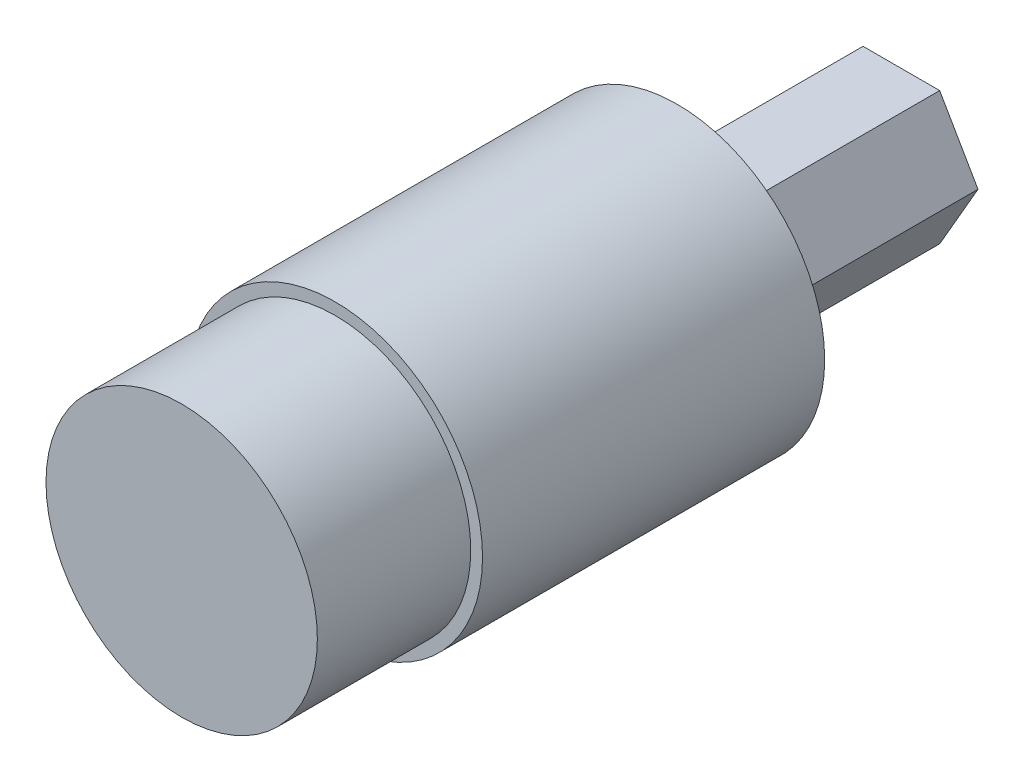
ISO-10303-21;
HEADER;
FILE_DESCRIPTION(('STEP AP214'),'2;1');
FILE_NAME('part.step','',(''),(''),'','','');
FILE_SCHEMA(('AUTOMOTIVE_DESIGN { 1 0 10303 214 1 1 1 1 }'));
ENDSEC;
DATA;
#1=APPLICATION_CONTEXT('core data for automotive mechanical design processes');
#2=APPLICATION_PROTOCOL_DEFINITION('international standard','automotive_design',2000,#1);
#3=PRODUCT_CONTEXT('',#1,'mechanical');
#4=PRODUCT('Part','Part','',(#3));
#5=PRODUCT_RELATED_PRODUCT_CATEGORY('part','',(#4));
#6=PRODUCT_DEFINITION_FORMATION('','',#4);
#7=PRODUCT_DEFINITION_CONTEXT('part definition',#1,'design');
#8=PRODUCT_DEFINITION('design','',#6,#7);
#9=PRODUCT_DEFINITION_SHAPE('','',#8);
#10=(LENGTH_UNIT() NAMED_UNIT(*) SI_UNIT(.MILLI.,.METRE.));
#11=(NAMED_UNIT(*) PLANE_ANGLE_UNIT() SI_UNIT($,.RADIAN.));
#12=(NAMED_UNIT(*) SI_UNIT($,.STERADIAN.) SOLID_ANGLE_UNIT());
#13=UNCERTAINTY_MEASURE_WITH_UNIT(LENGTH_MEASURE(1.E-05),#10,'distance_accuracy_value','');
#14=(GEOMETRIC_REPRESENTATION_CONTEXT(3) GLOBAL_UNCERTAINTY_ASSIGNED_CONTEXT((#13)) GLOBAL_UNIT_ASSIGNED_CONTEXT((#10,
#11,#12)) REPRESENTATION_CONTEXT('',''));
#15=CARTESIAN_POINT('',(0.,0.,0.));
#16=DIRECTION('',(0.,0.,1.));
#17=DIRECTION('',(1.,0.,0.));
#18=AXIS2_PLACEMENT_3D('',#15,#16,#17);
#19=CARTESIAN_POINT('',(0.,0.,53.34));
#20=DIRECTION('',(0.,0.,-1.));
#21=DIRECTION('',(-1.,0.,0.));
#22=AXIS2_PLACEMENT_3D('',#19,#20,#21);
#23=CYLINDRICAL_SURFACE('',#22,15.875);
#24=CARTESIAN_POINT('',(0.,0.,0.));
#25=DIRECTION('',(0.,0.,1.));
#26=DIRECTION('',(1.,0.,0.));
#27=AXIS2_PLACEMENT_3D('',#24,#25,#26);
#28=CIRCLE('',#27,15.875);
#29=CARTESIAN_POINT('',(15.875,0.,0.));
#30=VERTEX_POINT('',#29);
#31=EDGE_CURVE('E12',#30,#30,#28,.T.);
#32=ORIENTED_EDGE('',*,*,#31,.T.);
#33=EDGE_LOOP('',(#32));
#34=FACE_BOUND('',#33,.T.);
#35=CARTESIAN_POINT('',(1.47573332446882,-15.8062593979427,29.6111789912559));
#36=CARTESIAN_POINT('',(1.65475016865893,-15.7895418809201,29.6111718038457));
#37=CARTESIAN_POINT('',(1.83357595181604,-15.7697497542096,29.5959866783168));
#38=CARTESIAN_POINT('',(2.1855963327518,-15.7248331820091,29.5359643248302));
#39=CARTESIAN_POINT('',(2.35878508824279,-15.6997033954727,29.4910973003365));
#40=CARTESIAN_POINT('',(2.69443102462366,-15.6455914181036,29.3733512414853));
#41=CARTESIAN_POINT('',(2.85690301128605,-15.616614716234,29.3005118442731));
#42=CARTESIAN_POINT('',(3.16713215063405,-15.556667118741,29.1289877354717));
#43=CARTESIAN_POINT('',(3.31489040462805,-15.5256963726561,29.0303049602439));
#44=CARTESIAN_POINT('',(3.594451244585,-15.4633905024007,28.8077086166512));
#45=CARTESIAN_POINT('',(3.72591897938713,-15.4320588460277,28.6833730960508));
#46=CARTESIAN_POINT('',(3.96614112887061,-15.3720758002535,28.4138249607425));
#47=CARTESIAN_POINT('',(4.07489435082612,-15.3434245516427,28.2686112504087));
#48=CARTESIAN_POINT('',(4.2663065610253,-15.2913084693007,27.9613149981526));
#49=CARTESIAN_POINT('',(4.34900210998827,-15.2678363828417,27.7992565193034));
#50=CARTESIAN_POINT('',(4.48571690881626,-15.2282328705994,27.462628940546));
#51=CARTESIAN_POINT('',(4.53974404808165,-15.212099425434,27.2880632975707));
#52=CARTESIAN_POINT('',(4.6157447869748,-15.1892085292378,26.9380490132076));
#53=CARTESIAN_POINT('',(4.6387940300353,-15.1821368619704,26.7628544665595));
#54=CARTESIAN_POINT('',(4.65551331163094,-15.1770191051206,26.410953266033));
#55=CARTESIAN_POINT('',(4.64918899765341,-15.1789712805747,26.2342469093424));
#56=CARTESIAN_POINT('',(4.60802156074972,-15.1915169367208,25.88970037717));
#57=CARTESIAN_POINT('',(4.57400376056022,-15.2018603118785,25.7217513658796));
#58=CARTESIAN_POINT('',(4.47968073089897,-15.2299207267939,25.3940652981595));
#59=CARTESIAN_POINT('',(4.41937352633899,-15.2476383205625,25.2343288597378));
#60=CARTESIAN_POINT('',(4.27332938609346,-15.289215093064,24.924965853531));
#61=CARTESIAN_POINT('',(4.18723847795556,-15.3131591055378,24.7755181706815));
#62=CARTESIAN_POINT('',(3.99246080202612,-15.3650908394775,24.4929414278998));
#63=CARTESIAN_POINT('',(3.88376933976613,-15.3930794006867,24.3598157674394));
#64=CARTESIAN_POINT('',(3.64198057650366,-15.4521083647813,24.1081720150649));
#65=CARTESIAN_POINT('',(3.50809546844578,-15.4832252895963,23.9904281427386));
#66=CARTESIAN_POINT('',(3.22248961438754,-15.5451766099479,23.7789146659268));
#67=CARTESIAN_POINT('',(3.07076650801275,-15.5760109675112,23.6851482394284));
#68=CARTESIAN_POINT('',(2.75038951660609,-15.6357920934915,23.5226361796002));
#69=CARTESIAN_POINT('',(2.58147123856515,-15.664692553257,23.4543933647152));
#70=CARTESIAN_POINT('',(2.23381124161288,-15.718034457741,23.347652389426));
#71=CARTESIAN_POINT('',(2.05507060988741,-15.7424763946622,23.3091509441768));
#72=CARTESIAN_POINT('',(1.69596687531345,-15.785165877686,23.2637470722057));
#73=CARTESIAN_POINT('',(1.51568094673126,-15.8035102163008,23.2563267618504));
#74=CARTESIAN_POINT('',(1.15593642833655,-15.8338879163662,23.2722008014547));
#75=CARTESIAN_POINT('',(0.976477720403394,-15.8459222083724,23.2954906207464));
#76=CARTESIAN_POINT('',(0.628035379462351,-15.8635094134711,23.3713670438391));
#77=CARTESIAN_POINT('',(0.458904115662563,-15.8692096952214,23.4232435595835));
#78=CARTESIAN_POINT('',(0.131514431589141,-15.8753001599826,23.5543750850468));
#79=CARTESIAN_POINT('',(-0.0267441266246493,-15.8756904103734,23.6336297473468));
#80=CARTESIAN_POINT('',(-0.327421590863878,-15.8723341995013,23.8169854421605));
#81=CARTESIAN_POINT('',(-0.469886963327943,-15.8686002481245,23.9210105897608));
#82=CARTESIAN_POINT('',(-0.735612225693869,-15.8585060133157,24.1511249997145));
#83=CARTESIAN_POINT('',(-0.858870808693706,-15.8521455512735,24.2772157622568));
#84=CARTESIAN_POINT('',(-1.08414215080199,-15.8383451857864,24.549580021302));
#85=CARTESIAN_POINT('',(-1.18589076089499,-15.8308935737289,24.6960714662323));
#86=CARTESIAN_POINT('',(-1.36348367250784,-15.8165895809933,25.0040243286768));
#87=CARTESIAN_POINT('',(-1.43932744012994,-15.8097372126678,25.1654860546408));
#88=CARTESIAN_POINT('',(-1.56327281526235,-15.7979658368137,25.4997045076692));
#89=CARTESIAN_POINT('',(-1.61123693231466,-15.7930564485178,25.6725126124412));
#90=CARTESIAN_POINT('',(-1.67743949645949,-15.786163101869,26.0237865408233));
#91=CARTESIAN_POINT('',(-1.69567905662325,-15.7841790339741,26.2022521523262));
#92=CARTESIAN_POINT('',(-1.7018788838092,-15.7835117280442,26.5588063420732));
#93=CARTESIAN_POINT('',(-1.68999224227089,-15.784811800976,26.7368922423276));
#94=CARTESIAN_POINT('',(-1.63661314863291,-15.7904347796916,27.0885194965798));
#95=CARTESIAN_POINT('',(-1.59512048609089,-15.7947577069622,27.2620608182653));
#96=CARTESIAN_POINT('',(-1.4837778299595,-15.8056043985312,27.5995679864318));
#97=CARTESIAN_POINT('',(-1.41394949091216,-15.8121264815603,27.7635410359203));
#98=CARTESIAN_POINT('',(-1.24791192775978,-15.8260939776786,28.0774947676895));
#99=CARTESIAN_POINT('',(-1.15170205126861,-15.8335394135988,28.227475103823));
#100=CARTESIAN_POINT('',(-0.934988713488278,-15.847815065442,28.5100440368687));
#101=CARTESIAN_POINT('',(-0.814357756042988,-15.8546417684888,28.6425350671114));
#102=CARTESIAN_POINT('',(-0.552470645322964,-15.8659238020154,28.8854461666304));
#103=CARTESIAN_POINT('',(-0.411211521243918,-15.8703787904982,28.9958630514217));
#104=CARTESIAN_POINT('',(-0.112453032690774,-15.8753024221133,29.1911880791487));
#105=CARTESIAN_POINT('',(0.0450074883273529,-15.8757803848105,29.2761554082144));
#106=CARTESIAN_POINT('',(0.371794568793654,-15.871483690414,29.4183993672056));
#107=CARTESIAN_POINT('',(0.54110974696482,-15.8667140083862,29.4757021506471));
#108=CARTESIAN_POINT('',(0.83851009822069,-15.8533333362174,29.5492336606944));
#109=CARTESIAN_POINT('',(0.964980476238011,-15.8461577918051,29.57245088377));
#110=CARTESIAN_POINT('',(1.21957759480811,-15.8285988139637,29.6034260551002));
#111=CARTESIAN_POINT('',(1.34770432161807,-15.8182154071341,29.6111841315374));
#112=CARTESIAN_POINT('',(1.47573332446882,-15.8062593979427,29.6111789912559));
#113=B_SPLINE_CURVE_WITH_KNOTS('',3,(#35,#36,#37,#38,#39,#40,#41,#42,#43,#44,#45,#46,#47,#48,
#49,#50,#51,#52,#53,#54,#55,#56,#57,#58,#59,#60,#61,#62,#63,#64,#65,#66,#67,#68,#69,#70,#71,#72,
#73,#74,#75,#76,#77,#78,#79,#80,#81,#82,#83,#84,#85,#86,#87,#88,#89,#90,#91,#92,#93,#94,#95,#96,
#97,#98,#99,#100,#101,#102,#103,#104,#105,#106,#107,#108,#109,#110,#111,#112),.UNSPECIFIED.,.T.,
.F.,(4,2,2,2,2,2,2,2,2,2,2,2,2,2,2,2,2,2,2,2,2,2,2,2,2,2,2,2,2,2,2,2,2,2,2,2,2,2,4),(0.,
0.538908429208579,1.07835867079495,1.61704730959281,2.15569559772248,2.70403386967561,
3.25240092731696,3.79999512632357,4.34743855193872,4.87533457539628,5.40312910747947,
5.91574626590288,6.42840194321569,6.94844612927217,7.46859844427776,8.00907914613055,
8.54963144658328,9.10033262271266,9.65097296685112,10.1924009466221,10.7337490584176,
11.2622196318758,11.7906834994797,12.317548776118,12.844449887007,13.3774873466349,
13.9105357914802,14.4461911746698,14.9818264991479,15.5147453646002,16.047668018127,
16.5801841690014,17.1127134895967,17.6480982344426,18.1835601599125,18.717766956059,
19.2514677298451,19.6368866619712,20.0223023983036),.UNSPECIFIED.);
#114=CARTESIAN_POINT('',(1.47573332446882,-15.8062593979427,29.6111789912559));
#115=VERTEX_POINT('',#114);
#116=EDGE_CURVE('E112',#115,#115,#113,.T.);
#117=ORIENTED_EDGE('',*,*,#116,.T.);
#118=EDGE_LOOP('',(#117));
#119=FACE_BOUND('',#118,.T.);
#120=CARTESIAN_POINT('',(0.,0.,36.83));
#121=DIRECTION('',(0.,0.,1.));
#122=DIRECTION('',(1.,0.,0.));
#123=AXIS2_PLACEMENT_3D('',#120,#121,#122);
#124=CIRCLE('',#123,15.875);
#125=CARTESIAN_POINT('',(15.875,0.,36.83));
#126=VERTEX_POINT('',#125);
#127=EDGE_CURVE('E36',#126,#126,#124,.T.);
#128=ORIENTED_EDGE('',*,*,#127,.F.);
#129=EDGE_LOOP('',(#128));
#130=FACE_BOUND('',#129,.T.);
#131=ADVANCED_FACE('F32',(#34,#119,#130),#23,.T.);
#132=CARTESIAN_POINT('',(0.,0.,0.));
#133=DIRECTION('',(0.,0.,1.));
#134=DIRECTION('',(1.,0.,0.));
#135=AXIS2_PLACEMENT_3D('',#132,#133,#134);
#136=PLANE('',#135);
#137=ORIENTED_EDGE('',*,*,#31,.F.);
#138=EDGE_LOOP('',(#137));
#139=FACE_BOUND('',#138,.T.);
#140=DIRECTION('',(-0.5,0.866025403784439,0.));
#141=VECTOR('',#140,1.);
#142=CARTESIAN_POINT('',(-4.12444598552339,-7.14375,0.));
#143=LINE('',#142,#141);
#144=CARTESIAN_POINT('',(-4.12444598552339,-7.14375,0.));
#145=VERTEX_POINT('',#144);
#146=CARTESIAN_POINT('',(-8.24889197104678,0.,0.));
#147=VERTEX_POINT('',#146);
#148=EDGE_CURVE('E107',#145,#147,#143,.T.);
#149=ORIENTED_EDGE('',*,*,#148,.F.);
#150=DIRECTION('',(-1.,0.,0.));
#151=VECTOR('',#150,1.);
#152=CARTESIAN_POINT('',(4.12444598552339,-7.14375,0.));
#153=LINE('',#152,#151);
#154=CARTESIAN_POINT('',(4.12444598552339,-7.14375,0.));
#155=VERTEX_POINT('',#154);
#156=EDGE_CURVE('E104',#155,#145,#153,.T.);
#157=ORIENTED_EDGE('',*,*,#156,.F.);
#158=DIRECTION('',(-0.5,-0.866025403784439,0.));
#159=VECTOR('',#158,1.);
#160=CARTESIAN_POINT('',(8.24889197104678,0.,0.));
#161=LINE('',#160,#159);
#162=CARTESIAN_POINT('',(8.24889197104678,0.,0.));
#163=VERTEX_POINT('',#162);
#164=EDGE_CURVE('E205',#163,#155,#161,.T.);
#165=ORIENTED_EDGE('',*,*,#164,.F.);
#166=DIRECTION('',(0.5,-0.866025403784439,0.));
#167=VECTOR('',#166,1.);
#168=CARTESIAN_POINT('',(4.12444598552339,7.14375,0.));
#169=LINE('',#168,#167);
#170=CARTESIAN_POINT('',(4.12444598552339,7.14375,0.));
#171=VERTEX_POINT('',#170);
#172=EDGE_CURVE('E202',#171,#163,#169,.T.);
#173=ORIENTED_EDGE('',*,*,#172,.F.);
#174=DIRECTION('',(1.,0.,0.));
#175=VECTOR('',#174,1.);
#176=CARTESIAN_POINT('',(-4.12444598552338,7.14375,0.));
#177=LINE('',#176,#175);
#178=CARTESIAN_POINT('',(-4.12444598552338,7.14375,0.));
#179=VERTEX_POINT('',#178);
#180=EDGE_CURVE('E54',#179,#171,#177,.T.);
#181=ORIENTED_EDGE('',*,*,#180,.F.);
#182=DIRECTION('',(0.5,0.866025403784438,0.));
#183=VECTOR('',#182,1.);
#184=CARTESIAN_POINT('',(-8.24889197104678,0.,0.));
#185=LINE('',#184,#183);
#186=EDGE_CURVE('E49',#147,#179,#185,.T.);
#187=ORIENTED_EDGE('',*,*,#186,.F.);
#188=EDGE_LOOP('',(#149,#157,#165,#173,#181,#187));
#189=FACE_BOUND('',#188,.T.);
#190=ADVANCED_FACE('F135',(#139,#189),#136,.F.);
#191=CARTESIAN_POINT('',(-8.24889197104678,0.,-24.13));
#192=DIRECTION('',(0.,0.,-1.));
#193=DIRECTION('',(-1.,0.,0.));
#194=AXIS2_PLACEMENT_3D('',#191,#192,#193);
#195=PLANE('',#194);
#196=DIRECTION('',(-0.5,0.866025403784439,0.));
#197=VECTOR('',#196,1.);
#198=CARTESIAN_POINT('',(-4.12444598552339,-7.14375,-24.13));
#199=LINE('',#198,#197);
#200=CARTESIAN_POINT('',(-4.12444598552339,-7.14375,-24.13));
#201=VERTEX_POINT('',#200);
#202=CARTESIAN_POINT('',(-8.24889197104678,0.,-24.13));
#203=VERTEX_POINT('',#202);
#204=EDGE_CURVE('E94',#201,#203,#199,.T.);
#205=ORIENTED_EDGE('',*,*,#204,.T.);
#206=DIRECTION('',(0.5,0.866025403784438,0.));
#207=VECTOR('',#206,1.);
#208=CARTESIAN_POINT('',(-8.24889197104678,0.,-24.13));
#209=LINE('',#208,#207);
#210=CARTESIAN_POINT('',(-4.12444598552338,7.14375,-24.13));
#211=VERTEX_POINT('',#210);
#212=EDGE_CURVE('E84',#203,#211,#209,.T.);
#213=ORIENTED_EDGE('',*,*,#212,.T.);
#214=DIRECTION('',(1.,0.,0.));
#215=VECTOR('',#214,1.);
#216=CARTESIAN_POINT('',(-4.12444598552338,7.14375,-24.13));
#217=LINE('',#216,#215);
#218=CARTESIAN_POINT('',(4.12444598552339,7.14375,-24.13));
#219=VERTEX_POINT('',#218);
#220=EDGE_CURVE('E93',#211,#219,#217,.T.);
#221=ORIENTED_EDGE('',*,*,#220,.T.);
#222=DIRECTION('',(0.5,-0.866025403784439,0.));
#223=VECTOR('',#222,1.);
#224=CARTESIAN_POINT('',(4.12444598552339,7.14375,-24.13));
#225=LINE('',#224,#223);
#226=CARTESIAN_POINT('',(8.24889197104678,0.,-24.13));
#227=VERTEX_POINT('',#226);
#228=EDGE_CURVE('E193',#219,#227,#225,.T.);
#229=ORIENTED_EDGE('',*,*,#228,.T.);
#230=DIRECTION('',(-0.5,-0.866025403784439,0.));
#231=VECTOR('',#230,1.);
#232=CARTESIAN_POINT('',(8.24889197104678,0.,-24.13));
#233=LINE('',#232,#231);
#234=CARTESIAN_POINT('',(4.12444598552339,-7.14375,-24.13));
#235=VERTEX_POINT('',#234);
#236=EDGE_CURVE('E195',#227,#235,#233,.T.);
#237=ORIENTED_EDGE('',*,*,#236,.T.);
#238=DIRECTION('',(-1.,0.,0.));
#239=VECTOR('',#238,1.);
#240=CARTESIAN_POINT('',(4.12444598552339,-7.14375,-24.13));
#241=LINE('',#240,#239);
#242=EDGE_CURVE('E100',#235,#201,#241,.T.);
#243=ORIENTED_EDGE('',*,*,#242,.T.);
#244=EDGE_LOOP('',(#205,#213,#221,#229,#237,#243));
#245=FACE_BOUND('',#244,.T.);
#246=CARTESIAN_POINT('',(0.,0.,-24.13));
#247=DIRECTION('',(0.,0.,-1.));
#248=DIRECTION('',(-1.,0.,0.));
#249=AXIS2_PLACEMENT_3D('',#246,#247,#248);
#250=CIRCLE('',#249,4.3053);
#251=CARTESIAN_POINT('',(-4.3053,0.,-24.13));
#252=VERTEX_POINT('',#251);
#253=EDGE_CURVE('E188',#252,#252,#250,.T.);
#254=ORIENTED_EDGE('',*,*,#253,.F.);
#255=EDGE_LOOP('',(#254));
#256=FACE_BOUND('',#255,.T.);
#257=ADVANCED_FACE('F97',(#245,#256),#195,.T.);
#258=CARTESIAN_POINT('',(-4.12444598552339,-7.14375,-24.13));
#259=DIRECTION('',(0.866025403784439,0.5,0.));
#260=DIRECTION('',(-0.5,0.866025403784439,0.));
#261=AXIS2_PLACEMENT_3D('',#258,#259,#260);
#262=PLANE('',#261);
#263=ORIENTED_EDGE('',*,*,#148,.T.);
#264=DIRECTION('',(0.,0.,1.));
#265=VECTOR('',#264,1.);
#266=CARTESIAN_POINT('',(-8.24889197104678,0.,-24.13));
#267=LINE('',#266,#265);
#268=EDGE_CURVE('E41',#203,#147,#267,.T.);
#269=ORIENTED_EDGE('',*,*,#268,.F.);
#270=ORIENTED_EDGE('',*,*,#204,.F.);
#271=DIRECTION('',(0.,0.,1.));
#272=VECTOR('',#271,1.);
#273=CARTESIAN_POINT('',(-4.12444598552339,-7.14375,-24.13));
#274=LINE('',#273,#272);
#275=EDGE_CURVE('E198',#201,#145,#274,.T.);
#276=ORIENTED_EDGE('',*,*,#275,.T.);
#277=EDGE_LOOP('',(#263,#269,#270,#276));
#278=FACE_BOUND('',#277,.T.);
#279=ADVANCED_FACE('F106',(#278),#262,.F.);
#280=CARTESIAN_POINT('',(-8.24889197104678,0.,-24.13));
#281=DIRECTION('',(0.866025403784438,-0.5,0.));
#282=DIRECTION('',(0.5,0.866025403784439,0.));
#283=AXIS2_PLACEMENT_3D('',#280,#281,#282);
#284=PLANE('',#283);
#285=ORIENTED_EDGE('',*,*,#186,.T.);
#286=DIRECTION('',(0.,0.,1.));
#287=VECTOR('',#286,1.);
#288=CARTESIAN_POINT('',(-4.12444598552338,7.14375,-24.13));
#289=LINE('',#288,#287);
#290=EDGE_CURVE('E90',#211,#179,#289,.T.);
#291=ORIENTED_EDGE('',*,*,#290,.F.);
#292=ORIENTED_EDGE('',*,*,#212,.F.);
#293=ORIENTED_EDGE('',*,*,#268,.T.);
#294=EDGE_LOOP('',(#285,#291,#292,#293));
#295=FACE_BOUND('',#294,.T.);
#296=ADVANCED_FACE('F86',(#295),#284,.F.);
#297=CARTESIAN_POINT('',(-4.12444598552338,7.14375,-24.13));
#298=DIRECTION('',(0.,-1.,0.));
#299=DIRECTION('',(0.,0.,-1.));
#300=AXIS2_PLACEMENT_3D('',#297,#298,#299);
#301=PLANE('',#300);
#302=ORIENTED_EDGE('',*,*,#180,.T.);
#303=DIRECTION('',(0.,0.,1.));
#304=VECTOR('',#303,1.);
#305=CARTESIAN_POINT('',(4.12444598552339,7.14375,-24.13));
#306=LINE('',#305,#304);
#307=EDGE_CURVE('E109',#219,#171,#306,.T.);
#308=ORIENTED_EDGE('',*,*,#307,.F.);
#309=ORIENTED_EDGE('',*,*,#220,.F.);
#310=ORIENTED_EDGE('',*,*,#290,.T.);
#311=EDGE_LOOP('',(#302,#308,#309,#310));
#312=FACE_BOUND('',#311,.T.);
#313=ADVANCED_FACE('F146',(#312),#301,.F.);
#314=CARTESIAN_POINT('',(4.12444598552339,7.14375,-24.13));
#315=DIRECTION('',(-0.866025403784439,-0.5,0.));
#316=DIRECTION('',(0.5,-0.866025403784439,0.));
#317=AXIS2_PLACEMENT_3D('',#314,#315,#316);
#318=PLANE('',#317);
#319=ORIENTED_EDGE('',*,*,#172,.T.);
#320=DIRECTION('',(0.,0.,1.));
#321=VECTOR('',#320,1.);
#322=CARTESIAN_POINT('',(8.24889197104678,0.,-24.13));
#323=LINE('',#322,#321);
#324=EDGE_CURVE('E214',#227,#163,#323,.T.);
#325=ORIENTED_EDGE('',*,*,#324,.F.);
#326=ORIENTED_EDGE('',*,*,#228,.F.);
#327=ORIENTED_EDGE('',*,*,#307,.T.);
#328=EDGE_LOOP('',(#319,#325,#326,#327));
#329=FACE_BOUND('',#328,.T.);
#330=ADVANCED_FACE('F142',(#329),#318,.F.);
#331=CARTESIAN_POINT('',(8.24889197104678,0.,-24.13));
#332=DIRECTION('',(-0.866025403784439,0.5,0.));
#333=DIRECTION('',(-0.5,-0.866025403784439,0.));
#334=AXIS2_PLACEMENT_3D('',#331,#332,#333);
#335=PLANE('',#334);
#336=ORIENTED_EDGE('',*,*,#164,.T.);
#337=DIRECTION('',(0.,0.,1.));
#338=VECTOR('',#337,1.);
#339=CARTESIAN_POINT('',(4.12444598552339,-7.14375,-24.13));
#340=LINE('',#339,#338);
#341=EDGE_CURVE('E211',#235,#155,#340,.T.);
#342=ORIENTED_EDGE('',*,*,#341,.F.);
#343=ORIENTED_EDGE('',*,*,#236,.F.);
#344=ORIENTED_EDGE('',*,*,#324,.T.);
#345=EDGE_LOOP('',(#336,#342,#343,#344));
#346=FACE_BOUND('',#345,.T.);
#347=ADVANCED_FACE('F138',(#346),#335,.F.);
#348=CARTESIAN_POINT('',(4.12444598552339,-7.14375,-24.13));
#349=DIRECTION('',(0.,1.,0.));
#350=DIRECTION('',(-1.,0.,0.));
#351=AXIS2_PLACEMENT_3D('',#348,#349,#350);
#352=PLANE('',#351);
#353=ORIENTED_EDGE('',*,*,#156,.T.);
#354=ORIENTED_EDGE('',*,*,#275,.F.);
#355=ORIENTED_EDGE('',*,*,#242,.F.);
#356=ORIENTED_EDGE('',*,*,#341,.T.);
#357=EDGE_LOOP('',(#353,#354,#355,#356));
#358=FACE_BOUND('',#357,.T.);
#359=ADVANCED_FACE('F131',(#358),#352,.F.);
#360=CARTESIAN_POINT('',(0.,0.,-24.13));
#361=DIRECTION('',(0.,0.,1.));
#362=DIRECTION('',(1.,0.,0.));
#363=AXIS2_PLACEMENT_3D('',#360,#361,#362);
#364=CYLINDRICAL_SURFACE('',#363,4.3053);
#365=ORIENTED_EDGE('',*,*,#253,.T.);
#366=EDGE_LOOP('',(#365));
#367=FACE_BOUND('',#366,.T.);
#368=CARTESIAN_POINT('',(0.,0.,0.));
#369=DIRECTION('',(0.,0.,-1.));
#370=DIRECTION('',(-1.,0.,0.));
#371=AXIS2_PLACEMENT_3D('',#368,#369,#370);
#372=CIRCLE('',#371,4.3053);
#373=CARTESIAN_POINT('',(-4.3053,0.,0.));
#374=VERTEX_POINT('',#373);
#375=EDGE_CURVE('E117',#374,#374,#372,.T.);
#376=ORIENTED_EDGE('',*,*,#375,.F.);
#377=EDGE_LOOP('',(#376));
#378=FACE_BOUND('',#377,.T.);
#379=ADVANCED_FACE('F128',(#367,#378),#364,.F.);
#380=ORIENTED_EDGE('',*,*,#375,.T.);
#381=EDGE_LOOP('',(#380));
#382=FACE_BOUND('',#381,.T.);
#383=ADVANCED_FACE('F125',(#382),#136,.F.);
#384=CARTESIAN_POINT('',(1.47573332446882,-16.51,26.4361789912559));
#385=DIRECTION('',(0.,1.,0.));
#386=DIRECTION('',(0.,0.,1.));
#387=AXIS2_PLACEMENT_3D('',#384,#385,#386);
#388=CYLINDRICAL_SURFACE('',#387,3.175);
#389=CARTESIAN_POINT('',(1.47573332446882,-16.51,26.4361789912559));
#390=DIRECTION('',(0.,1.,0.));
#391=DIRECTION('',(0.,0.,1.));
#392=AXIS2_PLACEMENT_3D('',#389,#390,#391);
#393=CIRCLE('',#392,3.175);
#394=CARTESIAN_POINT('',(1.47573332446882,-16.51,29.6111789912559));
#395=VERTEX_POINT('',#394);
#396=EDGE_CURVE('E118',#395,#395,#393,.T.);
#397=ORIENTED_EDGE('',*,*,#396,.T.);
#398=EDGE_LOOP('',(#397));
#399=FACE_BOUND('',#398,.T.);
#400=ORIENTED_EDGE('',*,*,#116,.F.);
#401=EDGE_LOOP('',(#400));
#402=FACE_BOUND('',#401,.T.);
#403=ADVANCED_FACE('F119',(#399,#402),#388,.T.);
#404=CARTESIAN_POINT('',(1.47573332446882,-16.51,26.4361789912559));
#405=DIRECTION('',(0.,1.,0.));
#406=DIRECTION('',(0.,0.,1.));
#407=AXIS2_PLACEMENT_3D('',#404,#405,#406);
#408=PLANE('',#407);
#409=ORIENTED_EDGE('',*,*,#396,.F.);
#410=EDGE_LOOP('',(#409));
#411=FACE_BOUND('',#410,.T.);
#412=ADVANCED_FACE('F124',(#411),#408,.F.);
#413=CARTESIAN_POINT('',(0.,-0.317499999999995,36.83));
#414=DIRECTION('',(0.,0.,1.));
#415=DIRECTION('',(1.,0.,0.));
#416=AXIS2_PLACEMENT_3D('',#413,#414,#415);
#417=PLANE('',#416);
#418=CARTESIAN_POINT('',(0.,0.,36.83));
#419=DIRECTION('',(0.,0.,1.));
#420=DIRECTION('',(1.,0.,0.));
#421=AXIS2_PLACEMENT_3D('',#418,#419,#420);
#422=CIRCLE('',#421,14.605);
#423=CARTESIAN_POINT('',(14.605,0.,36.83));
#424=VERTEX_POINT('',#423);
#425=EDGE_CURVE('E177',#424,#424,#422,.T.);
#426=ORIENTED_EDGE('',*,*,#425,.F.);
#427=EDGE_LOOP('',(#426));
#428=FACE_BOUND('',#427,.T.);
#429=ORIENTED_EDGE('',*,*,#127,.T.);
#430=EDGE_LOOP('',(#429));
#431=FACE_BOUND('',#430,.T.);
#432=ADVANCED_FACE('F228',(#428,#431),#417,.T.);
#433=CARTESIAN_POINT('',(0.,0.,36.83));
#434=DIRECTION('',(0.,0.,1.));
#435=DIRECTION('',(1.,0.,0.));
#436=AXIS2_PLACEMENT_3D('',#433,#434,#435);
#437=CYLINDRICAL_SURFACE('',#436,14.605);
#438=ORIENTED_EDGE('',*,*,#425,.T.);
#439=EDGE_LOOP('',(#438));
#440=FACE_BOUND('',#439,.T.);
#441=CARTESIAN_POINT('',(0.,0.,53.34));
#442=DIRECTION('',(0.,0.,1.));
#443=DIRECTION('',(1.,0.,0.));
#444=AXIS2_PLACEMENT_3D('',#441,#442,#443);
#445=CIRCLE('',#444,14.605);
#446=CARTESIAN_POINT('',(14.605,0.,53.34));
#447=VERTEX_POINT('',#446);
#448=EDGE_CURVE('E181',#447,#447,#445,.T.);
#449=ORIENTED_EDGE('',*,*,#448,.F.);
#450=EDGE_LOOP('',(#449));
#451=FACE_BOUND('',#450,.T.);
#452=ADVANCED_FACE('F157',(#440,#451),#437,.T.);
#453=CARTESIAN_POINT('',(0.,0.,53.34));
#454=DIRECTION('',(0.,0.,1.));
#455=DIRECTION('',(1.,0.,0.));
#456=AXIS2_PLACEMENT_3D('',#453,#454,#455);
#457=PLANE('',#456);
#458=ORIENTED_EDGE('',*,*,#448,.T.);
#459=EDGE_LOOP('',(#458));
#460=FACE_BOUND('',#459,.T.);
#461=ADVANCED_FACE('F155',(#460),#457,.T.);
#462=CLOSED_SHELL('',(#131,#190,#257,#279,#296,#313,#330,#347,#359,#379,#383,#403,#412,#432,
#452,#461));
#463=MANIFOLD_SOLID_BREP('B2',#462);
#464=ADVANCED_BREP_SHAPE_REPRESENTATION('',(#18,#463),#14);
#465=SHAPE_DEFINITION_REPRESENTATION(#9,#464);
ENDSEC;
END-ISO-10303-21;
